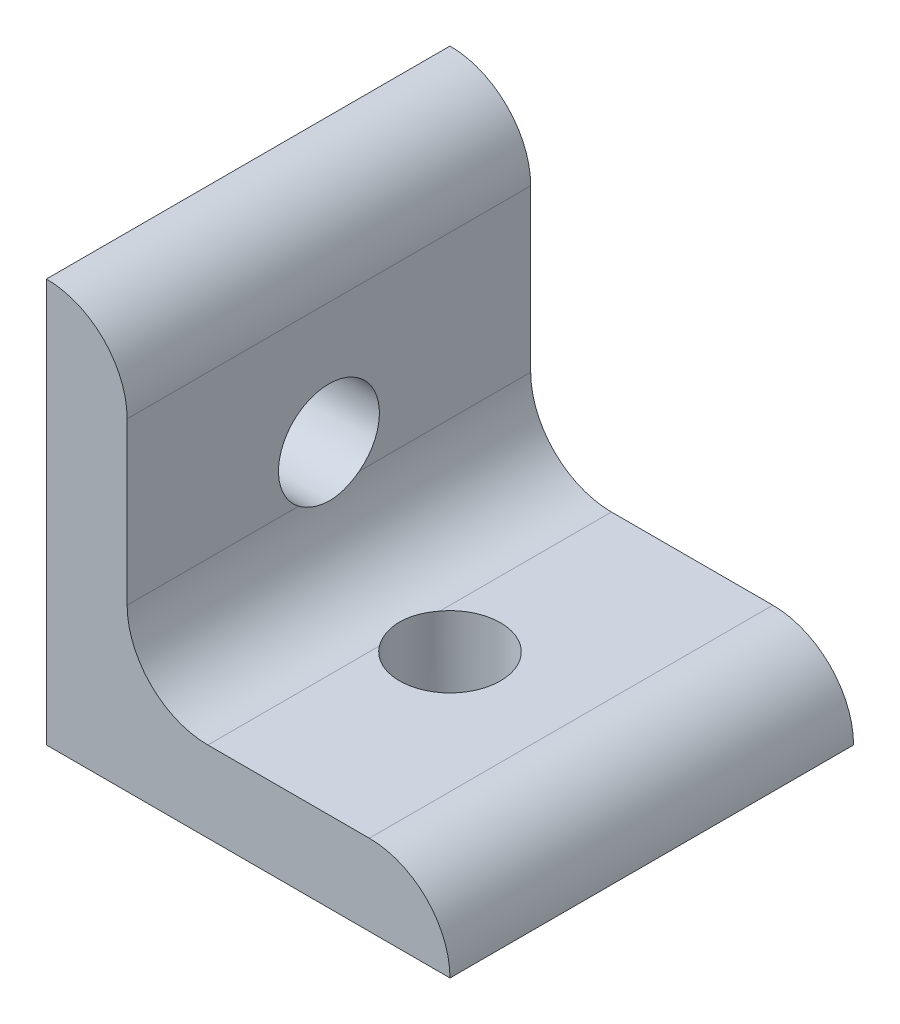
ISO-10303-21;
HEADER;
FILE_DESCRIPTION(('STEP AP214'),'2;1');
FILE_NAME('part.step','',(''),(''),'','','');
FILE_SCHEMA(('AUTOMOTIVE_DESIGN { 1 0 10303 214 1 1 1 1 }'));
ENDSEC;
DATA;
#1=APPLICATION_CONTEXT('core data for automotive mechanical design processes');
#2=APPLICATION_PROTOCOL_DEFINITION('international standard','automotive_design',2000,#1);
#3=PRODUCT_CONTEXT('',#1,'mechanical');
#4=PRODUCT('Part','Part','',(#3));
#5=PRODUCT_RELATED_PRODUCT_CATEGORY('part','',(#4));
#6=PRODUCT_DEFINITION_FORMATION('','',#4);
#7=PRODUCT_DEFINITION_CONTEXT('part definition',#1,'design');
#8=PRODUCT_DEFINITION('design','',#6,#7);
#9=PRODUCT_DEFINITION_SHAPE('','',#8);
#10=(LENGTH_UNIT() NAMED_UNIT(*) SI_UNIT(.MILLI.,.METRE.));
#11=(NAMED_UNIT(*) PLANE_ANGLE_UNIT() SI_UNIT($,.RADIAN.));
#12=(NAMED_UNIT(*) SI_UNIT($,.STERADIAN.) SOLID_ANGLE_UNIT());
#13=UNCERTAINTY_MEASURE_WITH_UNIT(LENGTH_MEASURE(1.E-05),#10,'distance_accuracy_value','');
#14=(GEOMETRIC_REPRESENTATION_CONTEXT(3) GLOBAL_UNCERTAINTY_ASSIGNED_CONTEXT((#13)) GLOBAL_UNIT_ASSIGNED_CONTEXT((#10,
#11,#12)) REPRESENTATION_CONTEXT('',''));
#15=CARTESIAN_POINT('',(0.,0.,0.));
#16=DIRECTION('',(0.,0.,1.));
#17=DIRECTION('',(1.,0.,0.));
#18=AXIS2_PLACEMENT_3D('',#15,#16,#17);
#19=CARTESIAN_POINT('',(0.,0.,25.4));
#20=DIRECTION('',(1.,0.,0.));
#21=DIRECTION('',(0.,1.,0.));
#22=AXIS2_PLACEMENT_3D('',#19,#20,#21);
#23=PLANE('',#22);
#24=CARTESIAN_POINT('',(0.,-12.7,12.7));
#25=DIRECTION('',(-1.,0.,0.));
#26=DIRECTION('',(0.,-1.,0.));
#27=AXIS2_PLACEMENT_3D('',#24,#25,#26);
#28=CIRCLE('',#27,3.175);
#29=CARTESIAN_POINT('',(0.,-15.875,12.7));
#30=VERTEX_POINT('',#29);
#31=EDGE_CURVE('E121',#30,#30,#28,.T.);
#32=ORIENTED_EDGE('',*,*,#31,.F.);
#33=EDGE_LOOP('',(#32));
#34=FACE_BOUND('',#33,.T.);
#35=DIRECTION('',(0.,-1.,0.));
#36=VECTOR('',#35,1.);
#37=CARTESIAN_POINT('',(0.,0.,0.));
#38=LINE('',#37,#36);
#39=CARTESIAN_POINT('',(0.,0.,0.));
#40=VERTEX_POINT('',#39);
#41=CARTESIAN_POINT('',(0.,-25.4,0.));
#42=VERTEX_POINT('',#41);
#43=EDGE_CURVE('E190',#40,#42,#38,.T.);
#44=ORIENTED_EDGE('',*,*,#43,.T.);
#45=DIRECTION('',(0.,0.,-1.));
#46=VECTOR('',#45,1.);
#47=CARTESIAN_POINT('',(0.,-25.4,25.4));
#48=LINE('',#47,#46);
#49=CARTESIAN_POINT('',(0.,-25.4,25.4));
#50=VERTEX_POINT('',#49);
#51=EDGE_CURVE('E193',#50,#42,#48,.T.);
#52=ORIENTED_EDGE('',*,*,#51,.F.);
#53=DIRECTION('',(0.,-1.,0.));
#54=VECTOR('',#53,1.);
#55=CARTESIAN_POINT('',(0.,0.,25.4));
#56=LINE('',#55,#54);
#57=CARTESIAN_POINT('',(0.,0.,25.4));
#58=VERTEX_POINT('',#57);
#59=EDGE_CURVE('E215',#58,#50,#56,.T.);
#60=ORIENTED_EDGE('',*,*,#59,.F.);
#61=DIRECTION('',(0.,0.,-1.));
#62=VECTOR('',#61,1.);
#63=CARTESIAN_POINT('',(0.,0.,25.4));
#64=LINE('',#63,#62);
#65=EDGE_CURVE('E130',#58,#40,#64,.T.);
#66=ORIENTED_EDGE('',*,*,#65,.T.);
#67=EDGE_LOOP('',(#44,#52,#60,#66));
#68=FACE_BOUND('',#67,.T.);
#69=ADVANCED_FACE('F35',(#34,#68),#23,.F.);
#70=CARTESIAN_POINT('',(0.,-25.4,25.4));
#71=DIRECTION('',(0.,1.,0.));
#72=DIRECTION('',(0.,0.,1.));
#73=AXIS2_PLACEMENT_3D('',#70,#71,#72);
#74=PLANE('',#73);
#75=CARTESIAN_POINT('',(12.7,-25.4,12.7));
#76=DIRECTION('',(0.,-1.,0.));
#77=DIRECTION('',(0.,0.,-1.));
#78=AXIS2_PLACEMENT_3D('',#75,#76,#77);
#79=CIRCLE('',#78,3.175);
#80=CARTESIAN_POINT('',(12.7,-25.4,9.525));
#81=VERTEX_POINT('',#80);
#82=EDGE_CURVE('E120',#81,#81,#79,.T.);
#83=ORIENTED_EDGE('',*,*,#82,.F.);
#84=EDGE_LOOP('',(#83));
#85=FACE_BOUND('',#84,.T.);
#86=DIRECTION('',(1.,0.,0.));
#87=VECTOR('',#86,1.);
#88=CARTESIAN_POINT('',(0.,-25.4,0.));
#89=LINE('',#88,#87);
#90=CARTESIAN_POINT('',(25.4,-25.4,0.));
#91=VERTEX_POINT('',#90);
#92=EDGE_CURVE('E197',#42,#91,#89,.T.);
#93=ORIENTED_EDGE('',*,*,#92,.T.);
#94=DIRECTION('',(0.,0.,-1.));
#95=VECTOR('',#94,1.);
#96=CARTESIAN_POINT('',(25.4,-25.4,25.4));
#97=LINE('',#96,#95);
#98=CARTESIAN_POINT('',(25.4,-25.4,25.4));
#99=VERTEX_POINT('',#98);
#100=EDGE_CURVE('E204',#99,#91,#97,.T.);
#101=ORIENTED_EDGE('',*,*,#100,.F.);
#102=DIRECTION('',(1.,0.,0.));
#103=VECTOR('',#102,1.);
#104=CARTESIAN_POINT('',(0.,-25.4,25.4));
#105=LINE('',#104,#103);
#106=EDGE_CURVE('E203',#50,#99,#105,.T.);
#107=ORIENTED_EDGE('',*,*,#106,.F.);
#108=ORIENTED_EDGE('',*,*,#51,.T.);
#109=EDGE_LOOP('',(#93,#101,#107,#108));
#110=FACE_BOUND('',#109,.T.);
#111=ADVANCED_FACE('F176',(#85,#110),#74,.F.);
#112=CARTESIAN_POINT('',(25.4,-20.32,25.4));
#113=DIRECTION('',(0.,-1.,0.));
#114=DIRECTION('',(1.,0.,0.));
#115=AXIS2_PLACEMENT_3D('',#112,#113,#114);
#116=PLANE('',#115);
#117=DIRECTION('',(0.,0.,-1.));
#118=VECTOR('',#117,1.);
#119=CARTESIAN_POINT('',(10.16,-20.32,25.4));
#120=LINE('',#119,#118);
#121=CARTESIAN_POINT('',(10.16,-20.32,0.));
#122=VERTEX_POINT('',#121);
#123=CARTESIAN_POINT('',(10.16,-20.32,10.795));
#124=VERTEX_POINT('',#123);
#125=EDGE_CURVE('E137',#122,#124,#120,.F.);
#126=ORIENTED_EDGE('',*,*,#125,.T.);
#127=CARTESIAN_POINT('',(12.7,-20.32,12.7));
#128=DIRECTION('',(0.,-1.,0.));
#129=DIRECTION('',(1.,0.,0.));
#130=AXIS2_PLACEMENT_3D('',#127,#128,#129);
#131=CIRCLE('',#130,3.175);
#132=CARTESIAN_POINT('',(10.16,-20.32,14.605));
#133=VERTEX_POINT('',#132);
#134=EDGE_CURVE('E61',#124,#133,#131,.T.);
#135=ORIENTED_EDGE('',*,*,#134,.T.);
#136=CARTESIAN_POINT('',(10.16,-20.32,25.4));
#137=VERTEX_POINT('',#136);
#138=EDGE_CURVE('E136',#133,#137,#120,.F.);
#139=ORIENTED_EDGE('',*,*,#138,.T.);
#140=DIRECTION('',(-1.,0.,0.));
#141=VECTOR('',#140,1.);
#142=CARTESIAN_POINT('',(25.4,-20.32,25.4));
#143=LINE('',#142,#141);
#144=CARTESIAN_POINT('',(20.32,-20.32,25.4));
#145=VERTEX_POINT('',#144);
#146=EDGE_CURVE('E220',#145,#137,#143,.T.);
#147=ORIENTED_EDGE('',*,*,#146,.F.);
#148=DIRECTION('',(0.,0.,-1.));
#149=VECTOR('',#148,1.);
#150=CARTESIAN_POINT('',(20.32,-20.32,25.4));
#151=LINE('',#150,#149);
#152=CARTESIAN_POINT('',(20.32,-20.32,0.));
#153=VERTEX_POINT('',#152);
#154=EDGE_CURVE('E129',#145,#153,#151,.T.);
#155=ORIENTED_EDGE('',*,*,#154,.T.);
#156=DIRECTION('',(-1.,0.,0.));
#157=VECTOR('',#156,1.);
#158=CARTESIAN_POINT('',(25.4,-20.32,0.));
#159=LINE('',#158,#157);
#160=EDGE_CURVE('E207',#153,#122,#159,.T.);
#161=ORIENTED_EDGE('',*,*,#160,.T.);
#162=EDGE_LOOP('',(#126,#135,#139,#147,#155,#161));
#163=FACE_BOUND('',#162,.T.);
#164=ADVANCED_FACE('F173',(#163),#116,.F.);
#165=CARTESIAN_POINT('',(5.08,-20.32,25.4));
#166=DIRECTION('',(-1.,0.,0.));
#167=DIRECTION('',(0.,0.,1.));
#168=AXIS2_PLACEMENT_3D('',#165,#166,#167);
#169=PLANE('',#168);
#170=DIRECTION('',(0.,0.,-1.));
#171=VECTOR('',#170,1.);
#172=CARTESIAN_POINT('',(5.08,-15.24,0.));
#173=LINE('',#172,#171);
#174=CARTESIAN_POINT('',(5.08,-15.24,25.4));
#175=VERTEX_POINT('',#174);
#176=CARTESIAN_POINT('',(5.08,-15.24,14.605));
#177=VERTEX_POINT('',#176);
#178=EDGE_CURVE('E119',#175,#177,#173,.T.);
#179=ORIENTED_EDGE('',*,*,#178,.T.);
#180=CARTESIAN_POINT('',(5.08,-12.7,12.7));
#181=DIRECTION('',(-1.,0.,0.));
#182=DIRECTION('',(0.,0.,1.));
#183=AXIS2_PLACEMENT_3D('',#180,#181,#182);
#184=CIRCLE('',#183,3.175);
#185=CARTESIAN_POINT('',(5.08,-15.24,10.795));
#186=VERTEX_POINT('',#185);
#187=EDGE_CURVE('E55',#177,#186,#184,.T.);
#188=ORIENTED_EDGE('',*,*,#187,.T.);
#189=CARTESIAN_POINT('',(5.08,-15.24,0.));
#190=VERTEX_POINT('',#189);
#191=EDGE_CURVE('E116',#186,#190,#173,.T.);
#192=ORIENTED_EDGE('',*,*,#191,.T.);
#193=DIRECTION('',(0.,1.,0.));
#194=VECTOR('',#193,1.);
#195=CARTESIAN_POINT('',(5.08,-20.32,0.));
#196=LINE('',#195,#194);
#197=CARTESIAN_POINT('',(5.08,-5.08,0.));
#198=VERTEX_POINT('',#197);
#199=EDGE_CURVE('E210',#190,#198,#196,.T.);
#200=ORIENTED_EDGE('',*,*,#199,.T.);
#201=DIRECTION('',(0.,0.,-1.));
#202=VECTOR('',#201,1.);
#203=CARTESIAN_POINT('',(5.08,-5.08,25.4));
#204=LINE('',#203,#202);
#205=CARTESIAN_POINT('',(5.08,-5.08,25.4));
#206=VERTEX_POINT('',#205);
#207=EDGE_CURVE('E127',#198,#206,#204,.F.);
#208=ORIENTED_EDGE('',*,*,#207,.T.);
#209=DIRECTION('',(0.,1.,0.));
#210=VECTOR('',#209,1.);
#211=CARTESIAN_POINT('',(5.08,-20.32,25.4));
#212=LINE('',#211,#210);
#213=EDGE_CURVE('E216',#175,#206,#212,.T.);
#214=ORIENTED_EDGE('',*,*,#213,.F.);
#215=EDGE_LOOP('',(#179,#188,#192,#200,#208,#214));
#216=FACE_BOUND('',#215,.T.);
#217=ADVANCED_FACE('F114',(#216),#169,.F.);
#218=CARTESIAN_POINT('',(0.,0.,25.4));
#219=DIRECTION('',(0.,0.,1.));
#220=DIRECTION('',(1.,0.,0.));
#221=AXIS2_PLACEMENT_3D('',#218,#219,#220);
#222=PLANE('',#221);
#223=ORIENTED_EDGE('',*,*,#213,.T.);
#224=CARTESIAN_POINT('',(0.,-5.08,25.4));
#225=DIRECTION('',(0.,0.,1.));
#226=DIRECTION('',(1.,0.,0.));
#227=AXIS2_PLACEMENT_3D('',#224,#225,#226);
#228=CIRCLE('',#227,5.08);
#229=EDGE_CURVE('E146',#206,#58,#228,.T.);
#230=ORIENTED_EDGE('',*,*,#229,.T.);
#231=ORIENTED_EDGE('',*,*,#59,.T.);
#232=ORIENTED_EDGE('',*,*,#106,.T.);
#233=CARTESIAN_POINT('',(20.32,-25.4,25.4));
#234=DIRECTION('',(0.,0.,1.));
#235=DIRECTION('',(1.,0.,0.));
#236=AXIS2_PLACEMENT_3D('',#233,#234,#235);
#237=CIRCLE('',#236,5.08);
#238=EDGE_CURVE('E144',#99,#145,#237,.T.);
#239=ORIENTED_EDGE('',*,*,#238,.T.);
#240=ORIENTED_EDGE('',*,*,#146,.T.);
#241=CARTESIAN_POINT('',(10.16,-15.24,25.4));
#242=DIRECTION('',(0.,0.,1.));
#243=DIRECTION('',(1.,0.,0.));
#244=AXIS2_PLACEMENT_3D('',#241,#242,#243);
#245=CIRCLE('',#244,5.08);
#246=EDGE_CURVE('E149',#137,#175,#245,.F.);
#247=ORIENTED_EDGE('',*,*,#246,.T.);
#248=EDGE_LOOP('',(#223,#230,#231,#232,#239,#240,#247));
#249=FACE_BOUND('',#248,.T.);
#250=ADVANCED_FACE('F163',(#249),#222,.T.);
#251=CARTESIAN_POINT('',(0.,0.,0.));
#252=DIRECTION('',(0.,0.,1.));
#253=DIRECTION('',(1.,0.,0.));
#254=AXIS2_PLACEMENT_3D('',#251,#252,#253);
#255=PLANE('',#254);
#256=ORIENTED_EDGE('',*,*,#43,.F.);
#257=CARTESIAN_POINT('',(0.,-5.08,0.));
#258=DIRECTION('',(0.,0.,1.));
#259=DIRECTION('',(1.,0.,0.));
#260=AXIS2_PLACEMENT_3D('',#257,#258,#259);
#261=CIRCLE('',#260,5.08);
#262=EDGE_CURVE('E142',#40,#198,#261,.F.);
#263=ORIENTED_EDGE('',*,*,#262,.T.);
#264=ORIENTED_EDGE('',*,*,#199,.F.);
#265=CARTESIAN_POINT('',(10.16,-15.24,0.));
#266=DIRECTION('',(0.,0.,1.));
#267=DIRECTION('',(1.,0.,0.));
#268=AXIS2_PLACEMENT_3D('',#265,#266,#267);
#269=CIRCLE('',#268,5.08);
#270=EDGE_CURVE('E125',#190,#122,#269,.T.);
#271=ORIENTED_EDGE('',*,*,#270,.T.);
#272=ORIENTED_EDGE('',*,*,#160,.F.);
#273=CARTESIAN_POINT('',(20.32,-25.4,0.));
#274=DIRECTION('',(0.,0.,1.));
#275=DIRECTION('',(1.,0.,0.));
#276=AXIS2_PLACEMENT_3D('',#273,#274,#275);
#277=CIRCLE('',#276,5.08);
#278=EDGE_CURVE('E140',#153,#91,#277,.F.);
#279=ORIENTED_EDGE('',*,*,#278,.T.);
#280=ORIENTED_EDGE('',*,*,#92,.F.);
#281=EDGE_LOOP('',(#256,#263,#264,#271,#272,#279,#280));
#282=FACE_BOUND('',#281,.T.);
#283=ADVANCED_FACE('F166',(#282),#255,.F.);
#284=CARTESIAN_POINT('',(10.16,-15.24,25.4));
#285=DIRECTION('',(0.,0.,1.));
#286=DIRECTION('',(1.,0.,0.));
#287=AXIS2_PLACEMENT_3D('',#284,#285,#286);
#288=CYLINDRICAL_SURFACE('',#287,5.08);
#289=ORIENTED_EDGE('',*,*,#191,.F.);
#290=CARTESIAN_POINT('',(5.08,-15.24,10.795));
#291=CARTESIAN_POINT('',(5.08000622076138,-15.2934961743454,10.8663139362508));
#292=CARTESIAN_POINT('',(5.08084532584465,-15.3439674405513,10.9398810245784));
#293=CARTESIAN_POINT('',(5.08365901561408,-15.4385353458437,11.0909701573009));
#294=CARTESIAN_POINT('',(5.08563343391803,-15.4826329178218,11.1684916206582));
#295=CARTESIAN_POINT('',(5.09018732473514,-15.5641364530103,11.3269437522636));
#296=CARTESIAN_POINT('',(5.09276667791673,-15.601543733409,11.4078737455534));
#297=CARTESIAN_POINT('',(5.09806869175897,-15.669420168339,11.5725637186365));
#298=CARTESIAN_POINT('',(5.10079135448241,-15.6998892229677,11.6563237391591));
#299=CARTESIAN_POINT('',(5.1085450287012,-15.78055555324,11.9110424549581));
#300=CARTESIAN_POINT('',(5.11316580376193,-15.8200655698348,12.085544184302));
#301=CARTESIAN_POINT('',(5.11906021589561,-15.8692384116216,12.4385817404295));
#302=CARTESIAN_POINT('',(5.12033560591346,-15.8789168686877,12.6171154050368));
#303=CARTESIAN_POINT('',(5.11899439089397,-15.8682422778549,12.9728084565063));
#304=CARTESIAN_POINT('',(5.11638812897204,-15.8479690409008,13.1499702356527));
#305=CARTESIAN_POINT('',(5.10845955043627,-15.7781110689611,13.4983992891177));
#306=CARTESIAN_POINT('',(5.1031365434831,-15.7285188833676,13.6696650534144));
#307=CARTESIAN_POINT('',(5.09339673869924,-15.6123879554241,13.9728913996411));
#308=CARTESIAN_POINT('',(5.08898171465396,-15.5502372516741,14.1065422268524));
#309=CARTESIAN_POINT('',(5.0839598226398,-15.4436528248265,14.2994991393626));
#310=CARTESIAN_POINT('',(5.08255279864353,-15.4059104220493,14.3625486887325));
#311=CARTESIAN_POINT('',(5.08057393325917,-15.3261320652233,14.485903560328));
#312=CARTESIAN_POINT('',(5.0800022817075,-15.2840951375751,14.5462082557765));
#313=CARTESIAN_POINT('',(5.08,-15.24,14.605));
#314=B_SPLINE_CURVE_WITH_KNOTS('',3,(#290,#291,#292,#293,#294,#295,#296,#297,#298,#299,#300,
#301,#302,#303,#304,#305,#306,#307,#308,#309,#310,#311,#312,#313),.UNSPECIFIED.,.F.,.F.,(4,2,2,
2,2,2,2,2,2,2,2,4),(0.,0.267344320512233,0.534649471211722,0.801901936652128,1.06915824998554,
1.60332309774615,2.13720799304534,2.66967283247601,3.2022730414616,3.64317057092607,
3.86349897389807,4.08387743820232),.UNSPECIFIED.);
#315=EDGE_CURVE('E11',#186,#177,#314,.T.);
#316=ORIENTED_EDGE('',*,*,#315,.T.);
#317=ORIENTED_EDGE('',*,*,#178,.F.);
#318=ORIENTED_EDGE('',*,*,#246,.F.);
#319=ORIENTED_EDGE('',*,*,#138,.F.);
#320=CARTESIAN_POINT('',(10.16,-20.32,14.605));
#321=CARTESIAN_POINT('',(10.1065038256546,-20.3199937792386,14.5336860637492));
#322=CARTESIAN_POINT('',(10.0560325594487,-20.3191546741554,14.4601189754216));
#323=CARTESIAN_POINT('',(9.96146465415628,-20.3163409843859,14.3090298426991));
#324=CARTESIAN_POINT('',(9.91736708217816,-20.314366566082,14.2315083793418));
#325=CARTESIAN_POINT('',(9.8358635469897,-20.3098126752649,14.0730562477364));
#326=CARTESIAN_POINT('',(9.79845626659103,-20.3072333220833,13.9921262544466));
#327=CARTESIAN_POINT('',(9.73057983166099,-20.301931308241,13.8274362813635));
#328=CARTESIAN_POINT('',(9.7001107770323,-20.2992086455176,13.7436762608409));
#329=CARTESIAN_POINT('',(9.61944444675997,-20.2914549712988,13.4889575450419));
#330=CARTESIAN_POINT('',(9.57993443016516,-20.2868341962381,13.314455815698));
#331=CARTESIAN_POINT('',(9.53076158837844,-20.2809397841044,12.9614182595705));
#332=CARTESIAN_POINT('',(9.52108313131227,-20.2796643940865,12.7828845949632));
#333=CARTESIAN_POINT('',(9.53175772214509,-20.281005609106,12.4271915434937));
#334=CARTESIAN_POINT('',(9.55203095909918,-20.283611871028,12.2500297643473));
#335=CARTESIAN_POINT('',(9.6218889310389,-20.2915404495637,11.9016007108823));
#336=CARTESIAN_POINT('',(9.67148111663243,-20.2968634565169,11.7303349465856));
#337=CARTESIAN_POINT('',(9.78761204457593,-20.3066032613008,11.4271086003589));
#338=CARTESIAN_POINT('',(9.84976274832595,-20.311018285346,11.2934577731476));
#339=CARTESIAN_POINT('',(9.95634717517354,-20.3160401773602,11.1005008606374));
#340=CARTESIAN_POINT('',(9.99408957795072,-20.3174472013565,11.0374513112675));
#341=CARTESIAN_POINT('',(10.0738679347767,-20.3194260667408,10.914096439672));
#342=CARTESIAN_POINT('',(10.1159048624249,-20.3199977182925,10.8537917442235));
#343=CARTESIAN_POINT('',(10.16,-20.32,10.795));
#344=B_SPLINE_CURVE_WITH_KNOTS('',3,(#320,#321,#322,#323,#324,#325,#326,#327,#328,#329,#330,
#331,#332,#333,#334,#335,#336,#337,#338,#339,#340,#341,#342,#343),.UNSPECIFIED.,.F.,.F.,(4,2,2,
2,2,2,2,2,2,2,2,4),(0.,0.267344320512231,0.534649471211721,0.801901936652128,1.06915824998554,
1.60332309774615,2.13720799304535,2.66967283247601,3.2022730414616,3.64317057092607,
3.86349897389807,4.08387743820232),.UNSPECIFIED.);
#345=EDGE_CURVE('E49',#133,#124,#344,.T.);
#346=ORIENTED_EDGE('',*,*,#345,.T.);
#347=ORIENTED_EDGE('',*,*,#125,.F.);
#348=ORIENTED_EDGE('',*,*,#270,.F.);
#349=EDGE_LOOP('',(#289,#316,#317,#318,#319,#346,#347,#348));
#350=FACE_BOUND('',#349,.T.);
#351=ADVANCED_FACE('F123',(#350),#288,.F.);
#352=CARTESIAN_POINT('',(0.,-5.08,25.4));
#353=DIRECTION('',(0.,0.,-1.));
#354=DIRECTION('',(-1.,0.,0.));
#355=AXIS2_PLACEMENT_3D('',#352,#353,#354);
#356=CYLINDRICAL_SURFACE('',#355,5.08);
#357=ORIENTED_EDGE('',*,*,#229,.F.);
#358=ORIENTED_EDGE('',*,*,#207,.F.);
#359=ORIENTED_EDGE('',*,*,#262,.F.);
#360=ORIENTED_EDGE('',*,*,#65,.F.);
#361=EDGE_LOOP('',(#357,#358,#359,#360));
#362=FACE_BOUND('',#361,.T.);
#363=ADVANCED_FACE('F246',(#362),#356,.T.);
#364=CARTESIAN_POINT('',(20.32,-25.4,25.4));
#365=DIRECTION('',(0.,0.,-1.));
#366=DIRECTION('',(-1.,0.,0.));
#367=AXIS2_PLACEMENT_3D('',#364,#365,#366);
#368=CYLINDRICAL_SURFACE('',#367,5.08);
#369=ORIENTED_EDGE('',*,*,#238,.F.);
#370=ORIENTED_EDGE('',*,*,#100,.T.);
#371=ORIENTED_EDGE('',*,*,#278,.F.);
#372=ORIENTED_EDGE('',*,*,#154,.F.);
#373=EDGE_LOOP('',(#369,#370,#371,#372));
#374=FACE_BOUND('',#373,.T.);
#375=ADVANCED_FACE('F37',(#374),#368,.T.);
#376=CARTESIAN_POINT('',(12.7,0.,12.7));
#377=DIRECTION('',(0.,-1.,0.));
#378=DIRECTION('',(0.,0.,-1.));
#379=AXIS2_PLACEMENT_3D('',#376,#377,#378);
#380=CYLINDRICAL_SURFACE('',#379,3.175);
#381=ORIENTED_EDGE('',*,*,#82,.T.);
#382=EDGE_LOOP('',(#381));
#383=FACE_BOUND('',#382,.T.);
#384=ORIENTED_EDGE('',*,*,#345,.F.);
#385=ORIENTED_EDGE('',*,*,#134,.F.);
#386=EDGE_LOOP('',(#384,#385));
#387=FACE_BOUND('',#386,.T.);
#388=ADVANCED_FACE('F157',(#383,#387),#380,.F.);
#389=CARTESIAN_POINT('',(25.4,-12.7,12.7));
#390=DIRECTION('',(-1.,0.,0.));
#391=DIRECTION('',(0.,-1.,0.));
#392=AXIS2_PLACEMENT_3D('',#389,#390,#391);
#393=CYLINDRICAL_SURFACE('',#392,3.175);
#394=ORIENTED_EDGE('',*,*,#31,.T.);
#395=EDGE_LOOP('',(#394));
#396=FACE_BOUND('',#395,.T.);
#397=ORIENTED_EDGE('',*,*,#315,.F.);
#398=ORIENTED_EDGE('',*,*,#187,.F.);
#399=EDGE_LOOP('',(#397,#398));
#400=FACE_BOUND('',#399,.T.);
#401=ADVANCED_FACE('F108',(#396,#400),#393,.F.);
#402=CLOSED_SHELL('',(#69,#111,#164,#217,#250,#283,#351,#363,#375,#388,#401));
#403=MANIFOLD_SOLID_BREP('B2',#402);
#404=ADVANCED_BREP_SHAPE_REPRESENTATION('',(#18,#403),#14);
#405=SHAPE_DEFINITION_REPRESENTATION(#9,#404);
ENDSEC;
END-ISO-10303-21;
